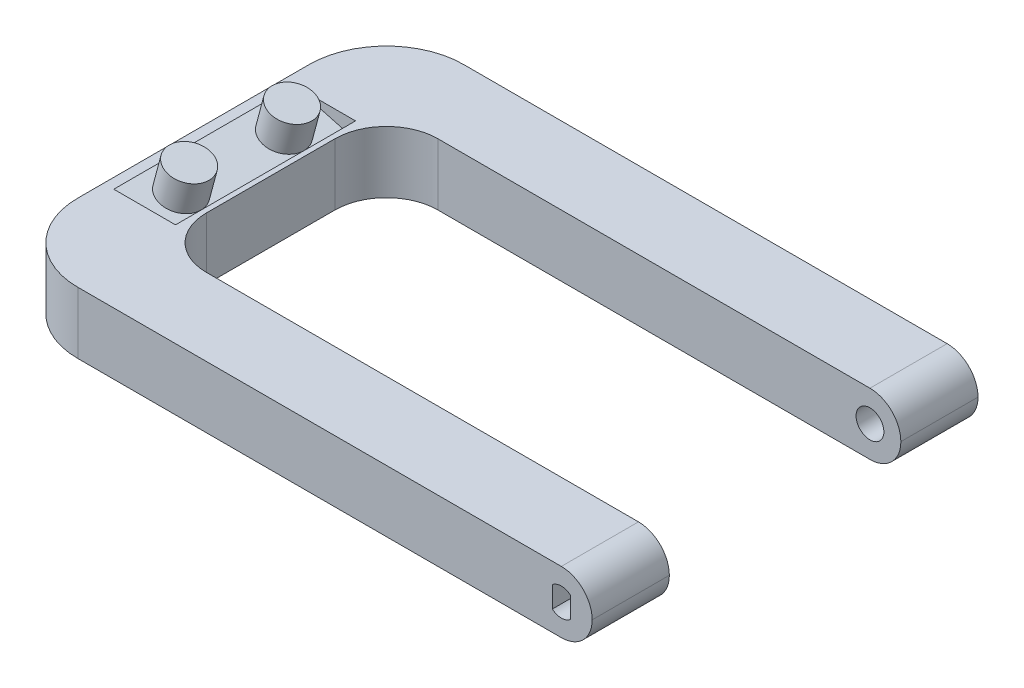
ISO-10303-21;
HEADER;
FILE_DESCRIPTION(('STEP AP214'),'2;1');
FILE_NAME('part.step','',(''),(''),'','','');
FILE_SCHEMA(('AUTOMOTIVE_DESIGN { 1 0 10303 214 1 1 1 1 }'));
ENDSEC;
DATA;
#1=APPLICATION_CONTEXT('core data for automotive mechanical design processes');
#2=APPLICATION_PROTOCOL_DEFINITION('international standard','automotive_design',2000,#1);
#3=PRODUCT_CONTEXT('',#1,'mechanical');
#4=PRODUCT('Part','Part','',(#3));
#5=PRODUCT_RELATED_PRODUCT_CATEGORY('part','',(#4));
#6=PRODUCT_DEFINITION_FORMATION('','',#4);
#7=PRODUCT_DEFINITION_CONTEXT('part definition',#1,'design');
#8=PRODUCT_DEFINITION('design','',#6,#7);
#9=PRODUCT_DEFINITION_SHAPE('','',#8);
#10=(LENGTH_UNIT() NAMED_UNIT(*) SI_UNIT(.MILLI.,.METRE.));
#11=(NAMED_UNIT(*) PLANE_ANGLE_UNIT() SI_UNIT($,.RADIAN.));
#12=(NAMED_UNIT(*) SI_UNIT($,.STERADIAN.) SOLID_ANGLE_UNIT());
#13=UNCERTAINTY_MEASURE_WITH_UNIT(LENGTH_MEASURE(1.E-05),#10,'distance_accuracy_value','');
#14=(GEOMETRIC_REPRESENTATION_CONTEXT(3) GLOBAL_UNCERTAINTY_ASSIGNED_CONTEXT((#13)) GLOBAL_UNIT_ASSIGNED_CONTEXT((#10,
#11,#12)) REPRESENTATION_CONTEXT('',''));
#15=CARTESIAN_POINT('',(0.,0.,0.));
#16=DIRECTION('',(0.,0.,1.));
#17=DIRECTION('',(1.,0.,0.));
#18=AXIS2_PLACEMENT_3D('',#15,#16,#17);
#19=CARTESIAN_POINT('',(-65.,6.,-37.5));
#20=DIRECTION('',(0.,0.,1.));
#21=DIRECTION('',(1.,0.,0.));
#22=AXIS2_PLACEMENT_3D('',#19,#20,#21);
#23=PLANE('',#22);
#24=CARTESIAN_POINT('',(44.,0.,-37.5));
#25=DIRECTION('',(0.,0.,1.));
#26=DIRECTION('',(1.,0.,0.));
#27=AXIS2_PLACEMENT_3D('',#24,#25,#26);
#28=CIRCLE('',#27,2.7);
#29=CARTESIAN_POINT('',(46.7,0.,-37.5));
#30=VERTEX_POINT('',#29);
#31=EDGE_CURVE('E568',#30,#30,#28,.T.);
#32=ORIENTED_EDGE('',*,*,#31,.T.);
#33=EDGE_LOOP('',(#32));
#34=FACE_BOUND('',#33,.T.);
#35=DIRECTION('',(-1.,0.,0.));
#36=VECTOR('',#35,1.);
#37=CARTESIAN_POINT('',(-65.,-6.,-37.5));
#38=LINE('',#37,#36);
#39=CARTESIAN_POINT('',(44.,-6.,-37.5));
#40=VERTEX_POINT('',#39);
#41=CARTESIAN_POINT('',(-50.,-6.,-37.5));
#42=VERTEX_POINT('',#41);
#43=EDGE_CURVE('E285',#40,#42,#38,.T.);
#44=ORIENTED_EDGE('',*,*,#43,.T.);
#45=DIRECTION('',(0.,-1.,0.));
#46=VECTOR('',#45,1.);
#47=CARTESIAN_POINT('',(-50.,6.,-37.5));
#48=LINE('',#47,#46);
#49=CARTESIAN_POINT('',(-50.,6.,-37.5));
#50=VERTEX_POINT('',#49);
#51=EDGE_CURVE('E366',#42,#50,#48,.F.);
#52=ORIENTED_EDGE('',*,*,#51,.T.);
#53=DIRECTION('',(-1.,0.,0.));
#54=VECTOR('',#53,1.);
#55=CARTESIAN_POINT('',(-65.,6.,-37.5));
#56=LINE('',#55,#54);
#57=CARTESIAN_POINT('',(44.,6.,-37.5));
#58=VERTEX_POINT('',#57);
#59=EDGE_CURVE('E261',#58,#50,#56,.T.);
#60=ORIENTED_EDGE('',*,*,#59,.F.);
#61=CARTESIAN_POINT('',(44.,0.,-37.5));
#62=DIRECTION('',(0.,0.,1.));
#63=DIRECTION('',(1.,0.,0.));
#64=AXIS2_PLACEMENT_3D('',#61,#62,#63);
#65=CIRCLE('',#64,6.);
#66=CARTESIAN_POINT('',(50.,0.,-37.5));
#67=VERTEX_POINT('',#66);
#68=EDGE_CURVE('E316',#58,#67,#65,.F.);
#69=ORIENTED_EDGE('',*,*,#68,.T.);
#70=CARTESIAN_POINT('',(44.,0.,-37.5));
#71=DIRECTION('',(0.,0.,1.));
#72=DIRECTION('',(1.,0.,0.));
#73=AXIS2_PLACEMENT_3D('',#70,#71,#72);
#74=CIRCLE('',#73,6.);
#75=EDGE_CURVE('E313',#67,#40,#74,.F.);
#76=ORIENTED_EDGE('',*,*,#75,.T.);
#77=EDGE_LOOP('',(#44,#52,#60,#69,#76));
#78=FACE_BOUND('',#77,.T.);
#79=ADVANCED_FACE('F41',(#34,#78),#23,.F.);
#80=CARTESIAN_POINT('',(-65.,6.,37.5));
#81=DIRECTION('',(1.,0.,0.));
#82=DIRECTION('',(0.,0.,-1.));
#83=AXIS2_PLACEMENT_3D('',#80,#81,#82);
#84=PLANE('',#83);
#85=DIRECTION('',(0.,0.,1.));
#86=VECTOR('',#85,1.);
#87=CARTESIAN_POINT('',(-65.,6.,37.5));
#88=LINE('',#87,#86);
#89=CARTESIAN_POINT('',(-65.,6.,-22.5));
#90=VERTEX_POINT('',#89);
#91=CARTESIAN_POINT('',(-65.,6.,22.5));
#92=VERTEX_POINT('',#91);
#93=EDGE_CURVE('E265',#90,#92,#88,.T.);
#94=ORIENTED_EDGE('',*,*,#93,.F.);
#95=DIRECTION('',(0.,-1.,0.));
#96=VECTOR('',#95,1.);
#97=CARTESIAN_POINT('',(-65.,6.,-22.5));
#98=LINE('',#97,#96);
#99=CARTESIAN_POINT('',(-65.,-6.,-22.5));
#100=VERTEX_POINT('',#99);
#101=EDGE_CURVE('E356',#90,#100,#98,.T.);
#102=ORIENTED_EDGE('',*,*,#101,.T.);
#103=DIRECTION('',(0.,0.,1.));
#104=VECTOR('',#103,1.);
#105=CARTESIAN_POINT('',(-65.,-6.,37.5));
#106=LINE('',#105,#104);
#107=CARTESIAN_POINT('',(-65.,-6.,22.5));
#108=VERTEX_POINT('',#107);
#109=EDGE_CURVE('E289',#100,#108,#106,.T.);
#110=ORIENTED_EDGE('',*,*,#109,.T.);
#111=DIRECTION('',(0.,-1.,0.));
#112=VECTOR('',#111,1.);
#113=CARTESIAN_POINT('',(-65.,6.,22.5));
#114=LINE('',#113,#112);
#115=EDGE_CURVE('E347',#108,#92,#114,.F.);
#116=ORIENTED_EDGE('',*,*,#115,.T.);
#117=EDGE_LOOP('',(#94,#102,#110,#116));
#118=FACE_BOUND('',#117,.T.);
#119=ADVANCED_FACE('F435',(#118),#84,.F.);
#120=CARTESIAN_POINT('',(50.,6.,37.5));
#121=DIRECTION('',(0.,0.,-1.));
#122=DIRECTION('',(-1.,0.,0.));
#123=AXIS2_PLACEMENT_3D('',#120,#121,#122);
#124=PLANE('',#123);
#125=DIRECTION('',(0.,1.,0.));
#126=VECTOR('',#125,1.);
#127=CARTESIAN_POINT('',(45.75,2.05608851949521,37.5));
#128=LINE('',#127,#126);
#129=CARTESIAN_POINT('',(45.75,-2.05608851949521,37.5));
#130=VERTEX_POINT('',#129);
#131=CARTESIAN_POINT('',(45.75,2.05608851949521,37.5));
#132=VERTEX_POINT('',#131);
#133=EDGE_CURVE('E208',#130,#132,#128,.T.);
#134=ORIENTED_EDGE('',*,*,#133,.F.);
#135=CARTESIAN_POINT('',(44.,0.,37.5));
#136=DIRECTION('',(0.,0.,1.));
#137=DIRECTION('',(1.,0.,0.));
#138=AXIS2_PLACEMENT_3D('',#135,#136,#137);
#139=CIRCLE('',#138,2.7);
#140=CARTESIAN_POINT('',(42.25,-2.05608851949521,37.5));
#141=VERTEX_POINT('',#140);
#142=EDGE_CURVE('E58',#141,#130,#139,.T.);
#143=ORIENTED_EDGE('',*,*,#142,.F.);
#144=DIRECTION('',(0.,-1.,0.));
#145=VECTOR('',#144,1.);
#146=CARTESIAN_POINT('',(42.25,-2.05608851949521,37.5));
#147=LINE('',#146,#145);
#148=CARTESIAN_POINT('',(42.25,2.05608851949521,37.5));
#149=VERTEX_POINT('',#148);
#150=EDGE_CURVE('E195',#149,#141,#147,.T.);
#151=ORIENTED_EDGE('',*,*,#150,.F.);
#152=CARTESIAN_POINT('',(44.,0.,37.5));
#153=DIRECTION('',(0.,0.,1.));
#154=DIRECTION('',(1.,0.,0.));
#155=AXIS2_PLACEMENT_3D('',#152,#153,#154);
#156=CIRCLE('',#155,2.7);
#157=EDGE_CURVE('E543',#132,#149,#156,.T.);
#158=ORIENTED_EDGE('',*,*,#157,.F.);
#159=EDGE_LOOP('',(#134,#143,#151,#158));
#160=FACE_BOUND('',#159,.T.);
#161=DIRECTION('',(1.,0.,0.));
#162=VECTOR('',#161,1.);
#163=CARTESIAN_POINT('',(50.,6.,37.5));
#164=LINE('',#163,#162);
#165=CARTESIAN_POINT('',(-50.,6.,37.5));
#166=VERTEX_POINT('',#165);
#167=CARTESIAN_POINT('',(44.,6.,37.5));
#168=VERTEX_POINT('',#167);
#169=EDGE_CURVE('E270',#166,#168,#164,.T.);
#170=ORIENTED_EDGE('',*,*,#169,.F.);
#171=DIRECTION('',(0.,-1.,0.));
#172=VECTOR('',#171,1.);
#173=CARTESIAN_POINT('',(-50.,6.,37.5));
#174=LINE('',#173,#172);
#175=CARTESIAN_POINT('',(-50.,-6.,37.5));
#176=VERTEX_POINT('',#175);
#177=EDGE_CURVE('E375',#166,#176,#174,.T.);
#178=ORIENTED_EDGE('',*,*,#177,.T.);
#179=DIRECTION('',(1.,0.,0.));
#180=VECTOR('',#179,1.);
#181=CARTESIAN_POINT('',(50.,-6.,37.5));
#182=LINE('',#181,#180);
#183=CARTESIAN_POINT('',(44.,-6.,37.5));
#184=VERTEX_POINT('',#183);
#185=EDGE_CURVE('E294',#176,#184,#182,.T.);
#186=ORIENTED_EDGE('',*,*,#185,.T.);
#187=CARTESIAN_POINT('',(44.,0.,37.5));
#188=DIRECTION('',(0.,0.,-1.));
#189=DIRECTION('',(-1.,0.,0.));
#190=AXIS2_PLACEMENT_3D('',#187,#188,#189);
#191=CIRCLE('',#190,6.);
#192=CARTESIAN_POINT('',(50.,0.,37.5));
#193=VERTEX_POINT('',#192);
#194=EDGE_CURVE('E344',#184,#193,#191,.F.);
#195=ORIENTED_EDGE('',*,*,#194,.T.);
#196=CARTESIAN_POINT('',(44.,0.,37.5));
#197=DIRECTION('',(0.,0.,-1.));
#198=DIRECTION('',(-1.,0.,0.));
#199=AXIS2_PLACEMENT_3D('',#196,#197,#198);
#200=CIRCLE('',#199,6.);
#201=EDGE_CURVE('E340',#193,#168,#200,.F.);
#202=ORIENTED_EDGE('',*,*,#201,.T.);
#203=EDGE_LOOP('',(#170,#178,#186,#195,#202));
#204=FACE_BOUND('',#203,.T.);
#205=ADVANCED_FACE('F441',(#160,#204),#124,.F.);
#206=CARTESIAN_POINT('',(-50.,6.,22.5));
#207=DIRECTION('',(0.,0.,1.));
#208=DIRECTION('',(1.,0.,0.));
#209=AXIS2_PLACEMENT_3D('',#206,#207,#208);
#210=PLANE('',#209);
#211=CARTESIAN_POINT('',(44.,0.,22.5));
#212=DIRECTION('',(0.,0.,1.));
#213=DIRECTION('',(1.,0.,0.));
#214=AXIS2_PLACEMENT_3D('',#211,#212,#213);
#215=CIRCLE('',#214,2.7);
#216=CARTESIAN_POINT('',(46.7,0.,22.5));
#217=VERTEX_POINT('',#216);
#218=EDGE_CURVE('E549',#217,#217,#215,.T.);
#219=ORIENTED_EDGE('',*,*,#218,.T.);
#220=EDGE_LOOP('',(#219));
#221=FACE_BOUND('',#220,.T.);
#222=DIRECTION('',(-1.,0.,0.));
#223=VECTOR('',#222,1.);
#224=CARTESIAN_POINT('',(-50.,-6.,22.5));
#225=LINE('',#224,#223);
#226=CARTESIAN_POINT('',(44.,-6.,22.5));
#227=VERTEX_POINT('',#226);
#228=CARTESIAN_POINT('',(-40.,-6.,22.5));
#229=VERTEX_POINT('',#228);
#230=EDGE_CURVE('E297',#227,#229,#225,.T.);
#231=ORIENTED_EDGE('',*,*,#230,.T.);
#232=DIRECTION('',(0.,-1.,0.));
#233=VECTOR('',#232,1.);
#234=CARTESIAN_POINT('',(-40.,6.,22.5));
#235=LINE('',#234,#233);
#236=CARTESIAN_POINT('',(-40.,6.,22.5));
#237=VERTEX_POINT('',#236);
#238=EDGE_CURVE('E390',#229,#237,#235,.F.);
#239=ORIENTED_EDGE('',*,*,#238,.T.);
#240=DIRECTION('',(-1.,0.,0.));
#241=VECTOR('',#240,1.);
#242=CARTESIAN_POINT('',(-50.,6.,22.5));
#243=LINE('',#242,#241);
#244=CARTESIAN_POINT('',(44.,6.,22.5));
#245=VERTEX_POINT('',#244);
#246=EDGE_CURVE('E273',#245,#237,#243,.T.);
#247=ORIENTED_EDGE('',*,*,#246,.F.);
#248=CARTESIAN_POINT('',(44.,0.,22.5));
#249=DIRECTION('',(0.,0.,1.));
#250=DIRECTION('',(1.,0.,0.));
#251=AXIS2_PLACEMENT_3D('',#248,#249,#250);
#252=CIRCLE('',#251,6.);
#253=CARTESIAN_POINT('',(50.,0.,22.5));
#254=VERTEX_POINT('',#253);
#255=EDGE_CURVE('E334',#245,#254,#252,.F.);
#256=ORIENTED_EDGE('',*,*,#255,.T.);
#257=CARTESIAN_POINT('',(44.,0.,22.5));
#258=DIRECTION('',(0.,0.,1.));
#259=DIRECTION('',(1.,0.,0.));
#260=AXIS2_PLACEMENT_3D('',#257,#258,#259);
#261=CIRCLE('',#260,6.);
#262=EDGE_CURVE('E337',#254,#227,#261,.F.);
#263=ORIENTED_EDGE('',*,*,#262,.T.);
#264=EDGE_LOOP('',(#231,#239,#247,#256,#263));
#265=FACE_BOUND('',#264,.T.);
#266=ADVANCED_FACE('F513',(#221,#265),#210,.F.);
#267=CARTESIAN_POINT('',(-50.,6.,-22.5));
#268=DIRECTION('',(-1.,0.,0.));
#269=DIRECTION('',(0.,0.,1.));
#270=AXIS2_PLACEMENT_3D('',#267,#268,#269);
#271=PLANE('',#270);
#272=DIRECTION('',(0.,0.,-1.));
#273=VECTOR('',#272,1.);
#274=CARTESIAN_POINT('',(-50.,-6.,-22.5));
#275=LINE('',#274,#273);
#276=CARTESIAN_POINT('',(-50.,-6.,12.5));
#277=VERTEX_POINT('',#276);
#278=CARTESIAN_POINT('',(-50.,-6.,-12.5));
#279=VERTEX_POINT('',#278);
#280=EDGE_CURVE('E301',#277,#279,#275,.T.);
#281=ORIENTED_EDGE('',*,*,#280,.T.);
#282=DIRECTION('',(0.,-1.,0.));
#283=VECTOR('',#282,1.);
#284=CARTESIAN_POINT('',(-50.,6.,-12.5));
#285=LINE('',#284,#283);
#286=CARTESIAN_POINT('',(-50.,6.,-12.5));
#287=VERTEX_POINT('',#286);
#288=EDGE_CURVE('E387',#279,#287,#285,.F.);
#289=ORIENTED_EDGE('',*,*,#288,.T.);
#290=DIRECTION('',(0.,0.,-1.));
#291=VECTOR('',#290,1.);
#292=CARTESIAN_POINT('',(-50.,6.,-22.5));
#293=LINE('',#292,#291);
#294=CARTESIAN_POINT('',(-50.,6.,12.5));
#295=VERTEX_POINT('',#294);
#296=EDGE_CURVE('E277',#295,#287,#293,.T.);
#297=ORIENTED_EDGE('',*,*,#296,.F.);
#298=DIRECTION('',(0.,-1.,0.));
#299=VECTOR('',#298,1.);
#300=CARTESIAN_POINT('',(-50.,-6.,12.5));
#301=LINE('',#300,#299);
#302=EDGE_CURVE('E383',#295,#277,#301,.T.);
#303=ORIENTED_EDGE('',*,*,#302,.T.);
#304=EDGE_LOOP('',(#281,#289,#297,#303));
#305=FACE_BOUND('',#304,.T.);
#306=ADVANCED_FACE('F518',(#305),#271,.F.);
#307=CARTESIAN_POINT('',(50.,6.,-22.5));
#308=DIRECTION('',(0.,0.,-1.));
#309=DIRECTION('',(-1.,0.,0.));
#310=AXIS2_PLACEMENT_3D('',#307,#308,#309);
#311=PLANE('',#310);
#312=CARTESIAN_POINT('',(44.,0.,-22.5));
#313=DIRECTION('',(0.,0.,-1.));
#314=DIRECTION('',(-1.,0.,0.));
#315=AXIS2_PLACEMENT_3D('',#312,#313,#314);
#316=CIRCLE('',#315,2.7);
#317=CARTESIAN_POINT('',(41.3,0.,-22.5));
#318=VERTEX_POINT('',#317);
#319=EDGE_CURVE('E45',#318,#318,#316,.T.);
#320=ORIENTED_EDGE('',*,*,#319,.T.);
#321=EDGE_LOOP('',(#320));
#322=FACE_BOUND('',#321,.T.);
#323=DIRECTION('',(1.,0.,0.));
#324=VECTOR('',#323,1.);
#325=CARTESIAN_POINT('',(50.,6.,-22.5));
#326=LINE('',#325,#324);
#327=CARTESIAN_POINT('',(-40.,6.,-22.5));
#328=VERTEX_POINT('',#327);
#329=CARTESIAN_POINT('',(44.,6.,-22.5));
#330=VERTEX_POINT('',#329);
#331=EDGE_CURVE('E281',#328,#330,#326,.T.);
#332=ORIENTED_EDGE('',*,*,#331,.F.);
#333=DIRECTION('',(0.,-1.,0.));
#334=VECTOR('',#333,1.);
#335=CARTESIAN_POINT('',(-40.,-6.,-22.5));
#336=LINE('',#335,#334);
#337=CARTESIAN_POINT('',(-40.,-6.,-22.5));
#338=VERTEX_POINT('',#337);
#339=EDGE_CURVE('E379',#328,#338,#336,.T.);
#340=ORIENTED_EDGE('',*,*,#339,.T.);
#341=DIRECTION('',(1.,0.,0.));
#342=VECTOR('',#341,1.);
#343=CARTESIAN_POINT('',(50.,-6.,-22.5));
#344=LINE('',#343,#342);
#345=CARTESIAN_POINT('',(44.,-6.,-22.5));
#346=VERTEX_POINT('',#345);
#347=EDGE_CURVE('E266',#338,#346,#344,.T.);
#348=ORIENTED_EDGE('',*,*,#347,.T.);
#349=CARTESIAN_POINT('',(44.,0.,-22.5));
#350=DIRECTION('',(0.,0.,-1.));
#351=DIRECTION('',(-1.,0.,0.));
#352=AXIS2_PLACEMENT_3D('',#349,#350,#351);
#353=CIRCLE('',#352,6.);
#354=CARTESIAN_POINT('',(50.,0.,-22.5));
#355=VERTEX_POINT('',#354);
#356=EDGE_CURVE('E319',#346,#355,#353,.F.);
#357=ORIENTED_EDGE('',*,*,#356,.T.);
#358=CARTESIAN_POINT('',(44.,0.,-22.5));
#359=DIRECTION('',(0.,0.,-1.));
#360=DIRECTION('',(-1.,0.,0.));
#361=AXIS2_PLACEMENT_3D('',#358,#359,#360);
#362=CIRCLE('',#361,6.);
#363=EDGE_CURVE('E322',#355,#330,#362,.F.);
#364=ORIENTED_EDGE('',*,*,#363,.T.);
#365=EDGE_LOOP('',(#332,#340,#348,#357,#364));
#366=FACE_BOUND('',#365,.T.);
#367=ADVANCED_FACE('F485',(#322,#366),#311,.F.);
#368=CARTESIAN_POINT('',(0.,6.,0.));
#369=DIRECTION('',(0.,-1.,0.));
#370=DIRECTION('',(0.,0.,-1.));
#371=AXIS2_PLACEMENT_3D('',#368,#369,#370);
#372=PLANE('',#371);
#373=DIRECTION('',(0.,0.,1.));
#374=VECTOR('',#373,1.);
#375=CARTESIAN_POINT('',(-63.,6.,-17.5));
#376=LINE('',#375,#374);
#377=CARTESIAN_POINT('',(-63.,6.,-17.5));
#378=VERTEX_POINT('',#377);
#379=CARTESIAN_POINT('',(-63.,6.,17.5));
#380=VERTEX_POINT('',#379);
#381=EDGE_CURVE('E242',#378,#380,#376,.T.);
#382=ORIENTED_EDGE('',*,*,#381,.F.);
#383=DIRECTION('',(-1.,0.,0.));
#384=VECTOR('',#383,1.);
#385=CARTESIAN_POINT('',(-51.,6.,-17.5));
#386=LINE('',#385,#384);
#387=CARTESIAN_POINT('',(-51.,6.,-17.5));
#388=VERTEX_POINT('',#387);
#389=EDGE_CURVE('E229',#388,#378,#386,.T.);
#390=ORIENTED_EDGE('',*,*,#389,.F.);
#391=DIRECTION('',(0.,0.,1.));
#392=VECTOR('',#391,1.);
#393=CARTESIAN_POINT('',(-51.,6.,-17.5));
#394=LINE('',#393,#392);
#395=CARTESIAN_POINT('',(-51.,6.,17.5));
#396=VERTEX_POINT('',#395);
#397=EDGE_CURVE('E251',#388,#396,#394,.T.);
#398=ORIENTED_EDGE('',*,*,#397,.T.);
#399=DIRECTION('',(-1.,0.,0.));
#400=VECTOR('',#399,1.);
#401=CARTESIAN_POINT('',(-51.,6.,17.5));
#402=LINE('',#401,#400);
#403=EDGE_CURVE('E228',#396,#380,#402,.T.);
#404=ORIENTED_EDGE('',*,*,#403,.T.);
#405=EDGE_LOOP('',(#382,#390,#398,#404));
#406=FACE_BOUND('',#405,.T.);
#407=ORIENTED_EDGE('',*,*,#59,.T.);
#408=CARTESIAN_POINT('',(-50.,6.,-22.5));
#409=DIRECTION('',(0.,-1.,0.));
#410=DIRECTION('',(0.,0.,-1.));
#411=AXIS2_PLACEMENT_3D('',#408,#409,#410);
#412=CIRCLE('',#411,15.);
#413=EDGE_CURVE('E372',#50,#90,#412,.F.);
#414=ORIENTED_EDGE('',*,*,#413,.T.);
#415=ORIENTED_EDGE('',*,*,#93,.T.);
#416=CARTESIAN_POINT('',(-50.,6.,22.5));
#417=DIRECTION('',(0.,-1.,0.));
#418=DIRECTION('',(0.,0.,-1.));
#419=AXIS2_PLACEMENT_3D('',#416,#417,#418);
#420=CIRCLE('',#419,15.);
#421=EDGE_CURVE('E369',#92,#166,#420,.F.);
#422=ORIENTED_EDGE('',*,*,#421,.T.);
#423=ORIENTED_EDGE('',*,*,#169,.T.);
#424=DIRECTION('',(0.,0.,-1.));
#425=VECTOR('',#424,1.);
#426=CARTESIAN_POINT('',(44.,6.,0.));
#427=LINE('',#426,#425);
#428=EDGE_CURVE('E284',#168,#245,#427,.T.);
#429=ORIENTED_EDGE('',*,*,#428,.T.);
#430=ORIENTED_EDGE('',*,*,#246,.T.);
#431=CARTESIAN_POINT('',(-40.,6.,12.5));
#432=DIRECTION('',(0.,-1.,0.));
#433=DIRECTION('',(0.,0.,-1.));
#434=AXIS2_PLACEMENT_3D('',#431,#432,#433);
#435=CIRCLE('',#434,10.);
#436=EDGE_CURVE('E402',#237,#295,#435,.T.);
#437=ORIENTED_EDGE('',*,*,#436,.T.);
#438=ORIENTED_EDGE('',*,*,#296,.T.);
#439=CARTESIAN_POINT('',(-40.,6.,-12.5));
#440=DIRECTION('',(0.,-1.,0.));
#441=DIRECTION('',(0.,0.,-1.));
#442=AXIS2_PLACEMENT_3D('',#439,#440,#441);
#443=CIRCLE('',#442,10.);
#444=EDGE_CURVE('E396',#287,#328,#443,.T.);
#445=ORIENTED_EDGE('',*,*,#444,.T.);
#446=ORIENTED_EDGE('',*,*,#331,.T.);
#447=DIRECTION('',(0.,0.,-1.));
#448=VECTOR('',#447,1.);
#449=CARTESIAN_POINT('',(44.,6.,0.));
#450=LINE('',#449,#448);
#451=EDGE_CURVE('E309',#330,#58,#450,.T.);
#452=ORIENTED_EDGE('',*,*,#451,.T.);
#453=EDGE_LOOP('',(#407,#414,#415,#422,#423,#429,#430,#437,#438,#445,#446,#452));
#454=FACE_BOUND('',#453,.T.);
#455=ADVANCED_FACE('F424',(#406,#454),#372,.F.);
#456=CARTESIAN_POINT('',(0.,-6.,0.));
#457=DIRECTION('',(0.,-1.,0.));
#458=DIRECTION('',(0.,0.,-1.));
#459=AXIS2_PLACEMENT_3D('',#456,#457,#458);
#460=PLANE('',#459);
#461=ORIENTED_EDGE('',*,*,#109,.F.);
#462=CARTESIAN_POINT('',(-50.,-6.,-22.5));
#463=DIRECTION('',(0.,-1.,0.));
#464=DIRECTION('',(0.,0.,-1.));
#465=AXIS2_PLACEMENT_3D('',#462,#463,#464);
#466=CIRCLE('',#465,15.);
#467=EDGE_CURVE('E363',#100,#42,#466,.T.);
#468=ORIENTED_EDGE('',*,*,#467,.T.);
#469=ORIENTED_EDGE('',*,*,#43,.F.);
#470=DIRECTION('',(0.,0.,-1.));
#471=VECTOR('',#470,1.);
#472=CARTESIAN_POINT('',(44.,-6.,-22.5));
#473=LINE('',#472,#471);
#474=EDGE_CURVE('E330',#40,#346,#473,.F.);
#475=ORIENTED_EDGE('',*,*,#474,.T.);
#476=ORIENTED_EDGE('',*,*,#347,.F.);
#477=CARTESIAN_POINT('',(-40.,-6.,-12.5));
#478=DIRECTION('',(0.,-1.,0.));
#479=DIRECTION('',(0.,0.,-1.));
#480=AXIS2_PLACEMENT_3D('',#477,#478,#479);
#481=CIRCLE('',#480,10.);
#482=EDGE_CURVE('E393',#338,#279,#481,.F.);
#483=ORIENTED_EDGE('',*,*,#482,.T.);
#484=ORIENTED_EDGE('',*,*,#280,.F.);
#485=CARTESIAN_POINT('',(-40.,-6.,12.5));
#486=DIRECTION('',(0.,-1.,0.));
#487=DIRECTION('',(0.,0.,-1.));
#488=AXIS2_PLACEMENT_3D('',#485,#486,#487);
#489=CIRCLE('',#488,10.);
#490=EDGE_CURVE('E399',#277,#229,#489,.F.);
#491=ORIENTED_EDGE('',*,*,#490,.T.);
#492=ORIENTED_EDGE('',*,*,#230,.F.);
#493=DIRECTION('',(0.,0.,-1.));
#494=VECTOR('',#493,1.);
#495=CARTESIAN_POINT('',(44.,-6.,37.5));
#496=LINE('',#495,#494);
#497=EDGE_CURVE('E326',#227,#184,#496,.F.);
#498=ORIENTED_EDGE('',*,*,#497,.T.);
#499=ORIENTED_EDGE('',*,*,#185,.F.);
#500=CARTESIAN_POINT('',(-50.,-6.,22.5));
#501=DIRECTION('',(0.,-1.,0.));
#502=DIRECTION('',(0.,0.,-1.));
#503=AXIS2_PLACEMENT_3D('',#500,#501,#502);
#504=CIRCLE('',#503,15.);
#505=EDGE_CURVE('E360',#176,#108,#504,.T.);
#506=ORIENTED_EDGE('',*,*,#505,.T.);
#507=EDGE_LOOP('',(#461,#468,#469,#475,#476,#483,#484,#491,#492,#498,#499,#506));
#508=FACE_BOUND('',#507,.T.);
#509=ADVANCED_FACE('F456',(#508),#460,.T.);
#510=CARTESIAN_POINT('',(44.,0.,-37.5));
#511=DIRECTION('',(0.,0.,1.));
#512=DIRECTION('',(1.,0.,0.));
#513=AXIS2_PLACEMENT_3D('',#510,#511,#512);
#514=CYLINDRICAL_SURFACE('',#513,6.);
#515=DIRECTION('',(0.,0.,-1.));
#516=VECTOR('',#515,1.);
#517=CARTESIAN_POINT('',(50.,0.,-37.5));
#518=LINE('',#517,#516);
#519=EDGE_CURVE('E290',#355,#67,#518,.T.);
#520=ORIENTED_EDGE('',*,*,#519,.F.);
#521=ORIENTED_EDGE('',*,*,#356,.F.);
#522=ORIENTED_EDGE('',*,*,#474,.F.);
#523=ORIENTED_EDGE('',*,*,#75,.F.);
#524=EDGE_LOOP('',(#520,#521,#522,#523));
#525=FACE_BOUND('',#524,.T.);
#526=ADVANCED_FACE('F452',(#525),#514,.T.);
#527=CARTESIAN_POINT('',(44.,0.,0.));
#528=DIRECTION('',(0.,0.,-1.));
#529=DIRECTION('',(-1.,0.,0.));
#530=AXIS2_PLACEMENT_3D('',#527,#528,#529);
#531=CYLINDRICAL_SURFACE('',#530,6.);
#532=ORIENTED_EDGE('',*,*,#363,.F.);
#533=ORIENTED_EDGE('',*,*,#519,.T.);
#534=ORIENTED_EDGE('',*,*,#68,.F.);
#535=ORIENTED_EDGE('',*,*,#451,.F.);
#536=EDGE_LOOP('',(#532,#533,#534,#535));
#537=FACE_BOUND('',#536,.T.);
#538=ADVANCED_FACE('F448',(#537),#531,.T.);
#539=CARTESIAN_POINT('',(44.,0.,0.));
#540=DIRECTION('',(0.,0.,-1.));
#541=DIRECTION('',(-1.,0.,0.));
#542=AXIS2_PLACEMENT_3D('',#539,#540,#541);
#543=CYLINDRICAL_SURFACE('',#542,6.);
#544=ORIENTED_EDGE('',*,*,#428,.F.);
#545=ORIENTED_EDGE('',*,*,#201,.F.);
#546=DIRECTION('',(0.,0.,-1.));
#547=VECTOR('',#546,1.);
#548=CARTESIAN_POINT('',(50.,0.,22.5));
#549=LINE('',#548,#547);
#550=EDGE_CURVE('E255',#254,#193,#549,.F.);
#551=ORIENTED_EDGE('',*,*,#550,.F.);
#552=ORIENTED_EDGE('',*,*,#255,.F.);
#553=EDGE_LOOP('',(#544,#545,#551,#552));
#554=FACE_BOUND('',#553,.T.);
#555=ADVANCED_FACE('F451',(#554),#543,.T.);
#556=CARTESIAN_POINT('',(44.,0.,22.5));
#557=DIRECTION('',(0.,0.,1.));
#558=DIRECTION('',(1.,0.,0.));
#559=AXIS2_PLACEMENT_3D('',#556,#557,#558);
#560=CYLINDRICAL_SURFACE('',#559,6.);
#561=ORIENTED_EDGE('',*,*,#194,.F.);
#562=ORIENTED_EDGE('',*,*,#497,.F.);
#563=ORIENTED_EDGE('',*,*,#262,.F.);
#564=ORIENTED_EDGE('',*,*,#550,.T.);
#565=EDGE_LOOP('',(#561,#562,#563,#564));
#566=FACE_BOUND('',#565,.T.);
#567=ADVANCED_FACE('F458',(#566),#560,.T.);
#568=CARTESIAN_POINT('',(-50.,6.,-22.5));
#569=DIRECTION('',(0.,-1.,0.));
#570=DIRECTION('',(0.,0.,-1.));
#571=AXIS2_PLACEMENT_3D('',#568,#569,#570);
#572=CYLINDRICAL_SURFACE('',#571,15.);
#573=ORIENTED_EDGE('',*,*,#413,.F.);
#574=ORIENTED_EDGE('',*,*,#51,.F.);
#575=ORIENTED_EDGE('',*,*,#467,.F.);
#576=ORIENTED_EDGE('',*,*,#101,.F.);
#577=EDGE_LOOP('',(#573,#574,#575,#576));
#578=FACE_BOUND('',#577,.T.);
#579=ADVANCED_FACE('F461',(#578),#572,.T.);
#580=CARTESIAN_POINT('',(-50.,6.,22.5));
#581=DIRECTION('',(0.,-1.,0.));
#582=DIRECTION('',(0.,0.,-1.));
#583=AXIS2_PLACEMENT_3D('',#580,#581,#582);
#584=CYLINDRICAL_SURFACE('',#583,15.);
#585=ORIENTED_EDGE('',*,*,#421,.F.);
#586=ORIENTED_EDGE('',*,*,#115,.F.);
#587=ORIENTED_EDGE('',*,*,#505,.F.);
#588=ORIENTED_EDGE('',*,*,#177,.F.);
#589=EDGE_LOOP('',(#585,#586,#587,#588));
#590=FACE_BOUND('',#589,.T.);
#591=ADVANCED_FACE('F468',(#590),#584,.T.);
#592=CARTESIAN_POINT('',(-40.,6.,-12.5));
#593=DIRECTION('',(0.,1.,0.));
#594=DIRECTION('',(0.,0.,1.));
#595=AXIS2_PLACEMENT_3D('',#592,#593,#594);
#596=CYLINDRICAL_SURFACE('',#595,10.);
#597=ORIENTED_EDGE('',*,*,#444,.F.);
#598=ORIENTED_EDGE('',*,*,#288,.F.);
#599=ORIENTED_EDGE('',*,*,#482,.F.);
#600=ORIENTED_EDGE('',*,*,#339,.F.);
#601=EDGE_LOOP('',(#597,#598,#599,#600));
#602=FACE_BOUND('',#601,.T.);
#603=ADVANCED_FACE('F471',(#602),#596,.F.);
#604=CARTESIAN_POINT('',(-40.,6.,12.5));
#605=DIRECTION('',(0.,1.,0.));
#606=DIRECTION('',(0.,0.,1.));
#607=AXIS2_PLACEMENT_3D('',#604,#605,#606);
#608=CYLINDRICAL_SURFACE('',#607,10.);
#609=ORIENTED_EDGE('',*,*,#436,.F.);
#610=ORIENTED_EDGE('',*,*,#238,.F.);
#611=ORIENTED_EDGE('',*,*,#490,.F.);
#612=ORIENTED_EDGE('',*,*,#302,.F.);
#613=EDGE_LOOP('',(#609,#610,#611,#612));
#614=FACE_BOUND('',#613,.T.);
#615=ADVANCED_FACE('F43',(#614),#608,.F.);
#616=CARTESIAN_POINT('',(-51.,2.78460969082661,-17.5));
#617=DIRECTION('',(1.,0.,0.));
#618=DIRECTION('',(0.,0.,-1.));
#619=AXIS2_PLACEMENT_3D('',#616,#617,#618);
#620=PLANE('',#619);
#621=DIRECTION('',(0.,1.,0.));
#622=VECTOR('',#621,1.);
#623=CARTESIAN_POINT('',(-51.,2.78460969082661,17.5));
#624=LINE('',#623,#622);
#625=CARTESIAN_POINT('',(-51.,2.78460969082661,17.5));
#626=VERTEX_POINT('',#625);
#627=EDGE_CURVE('E234',#626,#396,#624,.T.);
#628=ORIENTED_EDGE('',*,*,#627,.T.);
#629=ORIENTED_EDGE('',*,*,#397,.F.);
#630=DIRECTION('',(0.,1.,0.));
#631=VECTOR('',#630,1.);
#632=CARTESIAN_POINT('',(-51.,2.78460969082661,-17.5));
#633=LINE('',#632,#631);
#634=CARTESIAN_POINT('',(-51.,2.78460969082661,-17.5));
#635=VERTEX_POINT('',#634);
#636=EDGE_CURVE('E238',#635,#388,#633,.T.);
#637=ORIENTED_EDGE('',*,*,#636,.F.);
#638=DIRECTION('',(0.,0.,1.));
#639=VECTOR('',#638,1.);
#640=CARTESIAN_POINT('',(-51.,2.78460969082661,-17.5));
#641=LINE('',#640,#639);
#642=EDGE_CURVE('E256',#635,#626,#641,.T.);
#643=ORIENTED_EDGE('',*,*,#642,.T.);
#644=EDGE_LOOP('',(#628,#629,#637,#643));
#645=FACE_BOUND('',#644,.T.);
#646=ADVANCED_FACE('F415',(#645),#620,.F.);
#647=CARTESIAN_POINT('',(-63.,6.,-17.5));
#648=DIRECTION('',(-0.258819045102514,-0.96592582628907,0.));
#649=DIRECTION('',(0.96592582628907,-0.258819045102514,0.));
#650=AXIS2_PLACEMENT_3D('',#647,#648,#649);
#651=PLANE('',#650);
#652=CARTESIAN_POINT('',(-57.4019237886467,4.50000000000003,10.));
#653=DIRECTION('',(-0.258819045102514,-0.96592582628907,0.));
#654=DIRECTION('',(0.96592582628907,-0.258819045102514,0.));
#655=AXIS2_PLACEMENT_3D('',#652,#653,#654);
#656=CIRCLE('',#655,4.00000000000001);
#657=CARTESIAN_POINT('',(-53.5382204834904,3.46472381958997,10.));
#658=VERTEX_POINT('',#657);
#659=EDGE_CURVE('E12',#658,#658,#656,.F.);
#660=ORIENTED_EDGE('',*,*,#659,.F.);
#661=EDGE_LOOP('',(#660));
#662=FACE_BOUND('',#661,.T.);
#663=CARTESIAN_POINT('',(-57.4019237886467,4.50000000000003,-10.));
#664=DIRECTION('',(-0.258819045102514,-0.96592582628907,0.));
#665=DIRECTION('',(0.96592582628907,-0.258819045102514,0.));
#666=AXIS2_PLACEMENT_3D('',#663,#664,#665);
#667=CIRCLE('',#666,4.00000000000001);
#668=CARTESIAN_POINT('',(-53.5382204834904,3.46472381958997,-10.));
#669=VERTEX_POINT('',#668);
#670=EDGE_CURVE('E51',#669,#669,#667,.F.);
#671=ORIENTED_EDGE('',*,*,#670,.F.);
#672=EDGE_LOOP('',(#671));
#673=FACE_BOUND('',#672,.T.);
#674=DIRECTION('',(0.96592582628907,-0.258819045102514,0.));
#675=VECTOR('',#674,1.);
#676=CARTESIAN_POINT('',(-63.,6.,17.5));
#677=LINE('',#676,#675);
#678=EDGE_CURVE('E66',#380,#626,#677,.T.);
#679=ORIENTED_EDGE('',*,*,#678,.T.);
#680=ORIENTED_EDGE('',*,*,#642,.F.);
#681=DIRECTION('',(0.96592582628907,-0.258819045102514,0.));
#682=VECTOR('',#681,1.);
#683=CARTESIAN_POINT('',(-63.,6.,-17.5));
#684=LINE('',#683,#682);
#685=EDGE_CURVE('E233',#378,#635,#684,.T.);
#686=ORIENTED_EDGE('',*,*,#685,.F.);
#687=ORIENTED_EDGE('',*,*,#381,.T.);
#688=EDGE_LOOP('',(#679,#680,#686,#687));
#689=FACE_BOUND('',#688,.T.);
#690=ADVANCED_FACE('F411',(#662,#673,#689),#651,.F.);
#691=CARTESIAN_POINT('',(0.,0.,-17.5));
#692=DIRECTION('',(0.,0.,-1.));
#693=DIRECTION('',(-1.,0.,0.));
#694=AXIS2_PLACEMENT_3D('',#691,#692,#693);
#695=PLANE('',#694);
#696=ORIENTED_EDGE('',*,*,#389,.T.);
#697=ORIENTED_EDGE('',*,*,#685,.T.);
#698=ORIENTED_EDGE('',*,*,#636,.T.);
#699=EDGE_LOOP('',(#696,#697,#698));
#700=FACE_BOUND('',#699,.T.);
#701=ADVANCED_FACE('F414',(#700),#695,.F.);
#702=CARTESIAN_POINT('',(0.,0.,17.5));
#703=DIRECTION('',(0.,0.,-1.));
#704=DIRECTION('',(-1.,0.,0.));
#705=AXIS2_PLACEMENT_3D('',#702,#703,#704);
#706=PLANE('',#705);
#707=ORIENTED_EDGE('',*,*,#403,.F.);
#708=ORIENTED_EDGE('',*,*,#627,.F.);
#709=ORIENTED_EDGE('',*,*,#678,.F.);
#710=EDGE_LOOP('',(#707,#708,#709));
#711=FACE_BOUND('',#710,.T.);
#712=ADVANCED_FACE('F419',(#711),#706,.T.);
#713=CARTESIAN_POINT('',(-55.8490095180316,10.2955549577345,-10.));
#714=DIRECTION('',(-0.258819045102514,-0.96592582628907,0.));
#715=DIRECTION('',(0.96592582628907,-0.258819045102514,0.));
#716=AXIS2_PLACEMENT_3D('',#713,#714,#715);
#717=CYLINDRICAL_SURFACE('',#716,4.00000000000001);
#718=CARTESIAN_POINT('',(-55.8490095180316,10.2955549577345,-10.));
#719=DIRECTION('',(0.258819045102514,0.96592582628907,0.));
#720=DIRECTION('',(-0.96592582628907,0.258819045102514,0.));
#721=AXIS2_PLACEMENT_3D('',#718,#719,#720);
#722=CIRCLE('',#721,4.00000000000001);
#723=CARTESIAN_POINT('',(-59.7127128231879,11.3308311381445,-10.));
#724=VERTEX_POINT('',#723);
#725=EDGE_CURVE('E224',#724,#724,#722,.T.);
#726=ORIENTED_EDGE('',*,*,#725,.F.);
#727=EDGE_LOOP('',(#726));
#728=FACE_BOUND('',#727,.T.);
#729=ORIENTED_EDGE('',*,*,#670,.T.);
#730=EDGE_LOOP('',(#729));
#731=FACE_BOUND('',#730,.T.);
#732=ADVANCED_FACE('F409',(#728,#731),#717,.T.);
#733=CARTESIAN_POINT('',(-55.8490095180316,10.2955549577345,-10.));
#734=DIRECTION('',(0.258819045102514,0.96592582628907,0.));
#735=DIRECTION('',(-0.96592582628907,0.258819045102514,0.));
#736=AXIS2_PLACEMENT_3D('',#733,#734,#735);
#737=PLANE('',#736);
#738=ORIENTED_EDGE('',*,*,#725,.T.);
#739=EDGE_LOOP('',(#738));
#740=FACE_BOUND('',#739,.T.);
#741=ADVANCED_FACE('F599',(#740),#737,.T.);
#742=CARTESIAN_POINT('',(-55.8490095180316,10.2955549577345,10.));
#743=DIRECTION('',(-0.258819045102514,-0.96592582628907,0.));
#744=DIRECTION('',(0.96592582628907,-0.258819045102514,0.));
#745=AXIS2_PLACEMENT_3D('',#742,#743,#744);
#746=CYLINDRICAL_SURFACE('',#745,4.00000000000001);
#747=CARTESIAN_POINT('',(-55.8490095180316,10.2955549577345,10.));
#748=DIRECTION('',(0.258819045102514,0.96592582628907,0.));
#749=DIRECTION('',(-0.96592582628907,0.258819045102514,0.));
#750=AXIS2_PLACEMENT_3D('',#747,#748,#749);
#751=CIRCLE('',#750,4.00000000000001);
#752=CARTESIAN_POINT('',(-59.7127128231879,11.3308311381445,10.));
#753=VERTEX_POINT('',#752);
#754=EDGE_CURVE('E220',#753,#753,#751,.T.);
#755=ORIENTED_EDGE('',*,*,#754,.F.);
#756=EDGE_LOOP('',(#755));
#757=FACE_BOUND('',#756,.T.);
#758=ORIENTED_EDGE('',*,*,#659,.T.);
#759=EDGE_LOOP('',(#758));
#760=FACE_BOUND('',#759,.T.);
#761=ADVANCED_FACE('F595',(#757,#760),#746,.T.);
#762=CARTESIAN_POINT('',(-55.8490095180316,10.2955549577345,10.));
#763=DIRECTION('',(0.258819045102514,0.96592582628907,0.));
#764=DIRECTION('',(-0.96592582628907,0.258819045102514,0.));
#765=AXIS2_PLACEMENT_3D('',#762,#763,#764);
#766=PLANE('',#765);
#767=ORIENTED_EDGE('',*,*,#754,.T.);
#768=EDGE_LOOP('',(#767));
#769=FACE_BOUND('',#768,.T.);
#770=ADVANCED_FACE('F592',(#769),#766,.T.);
#771=CARTESIAN_POINT('',(44.,0.,31.5));
#772=DIRECTION('',(0.,0.,1.));
#773=DIRECTION('',(1.,0.,0.));
#774=AXIS2_PLACEMENT_3D('',#771,#772,#773);
#775=CYLINDRICAL_SURFACE('',#774,2.7);
#776=ORIENTED_EDGE('',*,*,#142,.T.);
#777=DIRECTION('',(0.,0.,1.));
#778=VECTOR('',#777,1.);
#779=CARTESIAN_POINT('',(45.75,-2.05608851949521,31.5));
#780=LINE('',#779,#778);
#781=CARTESIAN_POINT('',(45.75,-2.0560885194952,31.5));
#782=VERTEX_POINT('',#781);
#783=EDGE_CURVE('E202',#782,#130,#780,.T.);
#784=ORIENTED_EDGE('',*,*,#783,.F.);
#785=CARTESIAN_POINT('',(44.,0.,31.5));
#786=DIRECTION('',(0.,0.,1.));
#787=DIRECTION('',(1.,0.,0.));
#788=AXIS2_PLACEMENT_3D('',#785,#786,#787);
#789=CIRCLE('',#788,2.7);
#790=CARTESIAN_POINT('',(45.75,2.0560885194952,31.5));
#791=VERTEX_POINT('',#790);
#792=EDGE_CURVE('E190',#782,#791,#789,.T.);
#793=ORIENTED_EDGE('',*,*,#792,.T.);
#794=DIRECTION('',(0.,0.,1.));
#795=VECTOR('',#794,1.);
#796=CARTESIAN_POINT('',(45.75,2.05608851949521,31.5));
#797=LINE('',#796,#795);
#798=EDGE_CURVE('E200',#791,#132,#797,.T.);
#799=ORIENTED_EDGE('',*,*,#798,.T.);
#800=ORIENTED_EDGE('',*,*,#157,.T.);
#801=DIRECTION('',(0.,0.,1.));
#802=VECTOR('',#801,1.);
#803=CARTESIAN_POINT('',(42.25,2.05608851949521,31.5));
#804=LINE('',#803,#802);
#805=CARTESIAN_POINT('',(42.25,2.05608851949521,31.5));
#806=VERTEX_POINT('',#805);
#807=EDGE_CURVE('E211',#806,#149,#804,.T.);
#808=ORIENTED_EDGE('',*,*,#807,.F.);
#809=CARTESIAN_POINT('',(42.25,-2.0560885194952,31.5));
#810=VERTEX_POINT('',#809);
#811=EDGE_CURVE('E204',#806,#810,#789,.T.);
#812=ORIENTED_EDGE('',*,*,#811,.T.);
#813=DIRECTION('',(0.,0.,1.));
#814=VECTOR('',#813,1.);
#815=CARTESIAN_POINT('',(42.25,-2.05608851949521,31.5));
#816=LINE('',#815,#814);
#817=EDGE_CURVE('E215',#810,#141,#816,.T.);
#818=ORIENTED_EDGE('',*,*,#817,.T.);
#819=EDGE_LOOP('',(#776,#784,#793,#799,#800,#808,#812,#818));
#820=FACE_BOUND('',#819,.T.);
#821=ORIENTED_EDGE('',*,*,#218,.F.);
#822=EDGE_LOOP('',(#821));
#823=FACE_BOUND('',#822,.T.);
#824=ADVANCED_FACE('F197',(#820,#823),#775,.F.);
#825=CARTESIAN_POINT('',(42.25,-2.05608851949521,31.5));
#826=DIRECTION('',(-1.,0.,0.));
#827=DIRECTION('',(0.,0.,1.));
#828=AXIS2_PLACEMENT_3D('',#825,#826,#827);
#829=PLANE('',#828);
#830=ORIENTED_EDGE('',*,*,#150,.T.);
#831=ORIENTED_EDGE('',*,*,#817,.F.);
#832=DIRECTION('',(0.,-1.,0.));
#833=VECTOR('',#832,1.);
#834=CARTESIAN_POINT('',(42.25,-2.05608851949521,31.5));
#835=LINE('',#834,#833);
#836=EDGE_CURVE('E194',#806,#810,#835,.T.);
#837=ORIENTED_EDGE('',*,*,#836,.F.);
#838=ORIENTED_EDGE('',*,*,#807,.T.);
#839=EDGE_LOOP('',(#830,#831,#837,#838));
#840=FACE_BOUND('',#839,.T.);
#841=ADVANCED_FACE('F561',(#840),#829,.F.);
#842=CARTESIAN_POINT('',(45.75,2.05608851949521,31.5));
#843=DIRECTION('',(1.,0.,0.));
#844=DIRECTION('',(0.,0.,-1.));
#845=AXIS2_PLACEMENT_3D('',#842,#843,#844);
#846=PLANE('',#845);
#847=ORIENTED_EDGE('',*,*,#133,.T.);
#848=ORIENTED_EDGE('',*,*,#798,.F.);
#849=DIRECTION('',(0.,1.,0.));
#850=VECTOR('',#849,1.);
#851=CARTESIAN_POINT('',(45.75,2.05608851949521,31.5));
#852=LINE('',#851,#850);
#853=EDGE_CURVE('E187',#782,#791,#852,.T.);
#854=ORIENTED_EDGE('',*,*,#853,.F.);
#855=ORIENTED_EDGE('',*,*,#783,.T.);
#856=EDGE_LOOP('',(#847,#848,#854,#855));
#857=FACE_BOUND('',#856,.T.);
#858=ADVANCED_FACE('F206',(#857),#846,.F.);
#859=CARTESIAN_POINT('',(44.,0.,-37.5));
#860=DIRECTION('',(0.,0.,1.));
#861=DIRECTION('',(1.,0.,0.));
#862=AXIS2_PLACEMENT_3D('',#859,#860,#861);
#863=CYLINDRICAL_SURFACE('',#862,2.7);
#864=ORIENTED_EDGE('',*,*,#31,.F.);
#865=EDGE_LOOP('',(#864));
#866=FACE_BOUND('',#865,.T.);
#867=ORIENTED_EDGE('',*,*,#319,.F.);
#868=EDGE_LOOP('',(#867));
#869=FACE_BOUND('',#868,.T.);
#870=ADVANCED_FACE('F576',(#866,#869),#863,.F.);
#871=CARTESIAN_POINT('',(44.,0.,31.5));
#872=DIRECTION('',(0.,0.,1.));
#873=DIRECTION('',(1.,0.,0.));
#874=AXIS2_PLACEMENT_3D('',#871,#872,#873);
#875=PLANE('',#874);
#876=ORIENTED_EDGE('',*,*,#853,.T.);
#877=ORIENTED_EDGE('',*,*,#792,.F.);
#878=EDGE_LOOP('',(#876,#877));
#879=FACE_BOUND('',#878,.T.);
#880=ADVANCED_FACE('F189',(#879),#875,.F.);
#881=ORIENTED_EDGE('',*,*,#836,.T.);
#882=ORIENTED_EDGE('',*,*,#811,.F.);
#883=EDGE_LOOP('',(#881,#882));
#884=FACE_BOUND('',#883,.T.);
#885=ADVANCED_FACE('F584',(#884),#875,.F.);
#886=CLOSED_SHELL('',(#79,#119,#205,#266,#306,#367,#455,#509,#526,#538,#555,#567,#579,#591,#603,
#615,#646,#690,#701,#712,#732,#741,#761,#770,#824,#841,#858,#870,#880,#885));
#887=MANIFOLD_SOLID_BREP('B2',#886);
#888=ADVANCED_BREP_SHAPE_REPRESENTATION('',(#18,#887),#14);
#889=SHAPE_DEFINITION_REPRESENTATION(#9,#888);
ENDSEC;
END-ISO-10303-21;
